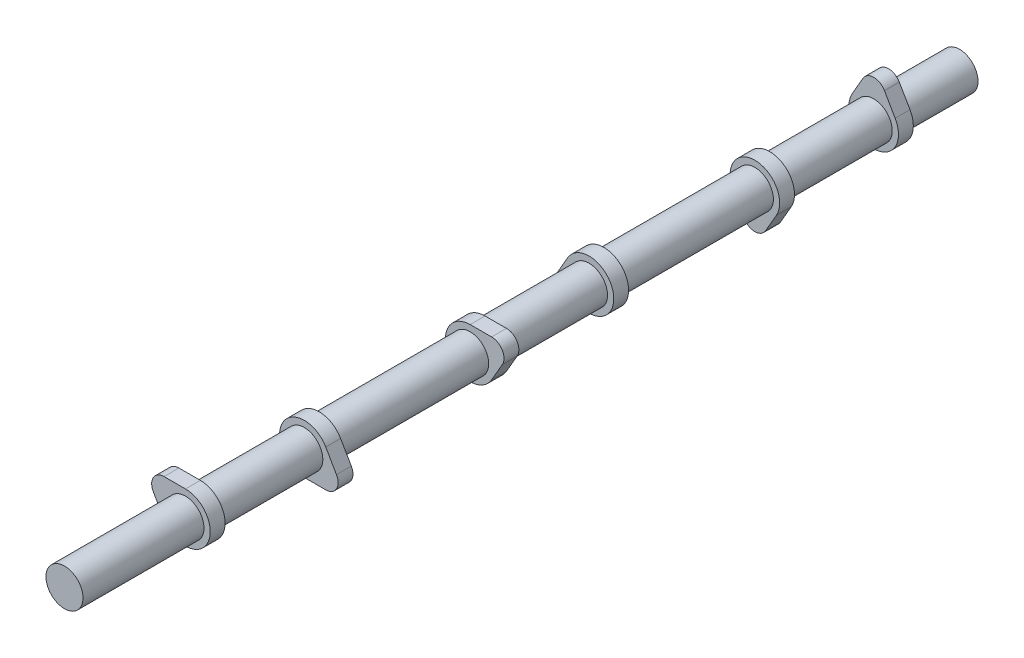
ISO-10303-21;
HEADER;
FILE_DESCRIPTION(('STEP AP214'),'2;1');
FILE_NAME('part.step','',(''),(''),'','','');
FILE_SCHEMA(('AUTOMOTIVE_DESIGN { 1 0 10303 214 1 1 1 1 }'));
ENDSEC;
DATA;
#1=APPLICATION_CONTEXT('core data for automotive mechanical design processes');
#2=APPLICATION_PROTOCOL_DEFINITION('international standard','automotive_design',2000,#1);
#3=PRODUCT_CONTEXT('',#1,'mechanical');
#4=PRODUCT('Part','Part','',(#3));
#5=PRODUCT_RELATED_PRODUCT_CATEGORY('part','',(#4));
#6=PRODUCT_DEFINITION_FORMATION('','',#4);
#7=PRODUCT_DEFINITION_CONTEXT('part definition',#1,'design');
#8=PRODUCT_DEFINITION('design','',#6,#7);
#9=PRODUCT_DEFINITION_SHAPE('','',#8);
#10=(LENGTH_UNIT() NAMED_UNIT(*) SI_UNIT(.MILLI.,.METRE.));
#11=(NAMED_UNIT(*) PLANE_ANGLE_UNIT() SI_UNIT($,.RADIAN.));
#12=(NAMED_UNIT(*) SI_UNIT($,.STERADIAN.) SOLID_ANGLE_UNIT());
#13=UNCERTAINTY_MEASURE_WITH_UNIT(LENGTH_MEASURE(1.E-05),#10,'distance_accuracy_value','');
#14=(GEOMETRIC_REPRESENTATION_CONTEXT(3) GLOBAL_UNCERTAINTY_ASSIGNED_CONTEXT((#13)) GLOBAL_UNIT_ASSIGNED_CONTEXT((#10,
#11,#12)) REPRESENTATION_CONTEXT('',''));
#15=CARTESIAN_POINT('',(0.,0.,0.));
#16=DIRECTION('',(0.,0.,1.));
#17=DIRECTION('',(1.,0.,0.));
#18=AXIS2_PLACEMENT_3D('',#15,#16,#17);
#19=CARTESIAN_POINT('',(0.,0.,116.84));
#20=DIRECTION('',(0.,0.,-1.));
#21=DIRECTION('',(-1.,0.,0.));
#22=AXIS2_PLACEMENT_3D('',#19,#20,#21);
#23=CYLINDRICAL_SURFACE('',#22,9.5);
#24=CARTESIAN_POINT('',(0.,0.,-3.80999999999999));
#25=DIRECTION('',(0.,0.,1.));
#26=DIRECTION('',(1.,0.,0.));
#27=AXIS2_PLACEMENT_3D('',#24,#25,#26);
#28=CIRCLE('',#27,9.5);
#29=CARTESIAN_POINT('',(9.5,0.,-3.80999999999999));
#30=VERTEX_POINT('',#29);
#31=EDGE_CURVE('E236',#30,#30,#28,.T.);
#32=ORIENTED_EDGE('',*,*,#31,.F.);
#33=EDGE_LOOP('',(#32));
#34=FACE_BOUND('',#33,.T.);
#35=CARTESIAN_POINT('',(0.,0.,-40.21));
#36=DIRECTION('',(0.,0.,-1.));
#37=DIRECTION('',(-1.,0.,0.));
#38=AXIS2_PLACEMENT_3D('',#35,#36,#37);
#39=CIRCLE('',#38,9.5);
#40=CARTESIAN_POINT('',(-9.5,0.,-40.21));
#41=VERTEX_POINT('',#40);
#42=EDGE_CURVE('E486',#41,#41,#39,.T.);
#43=ORIENTED_EDGE('',*,*,#42,.F.);
#44=EDGE_LOOP('',(#43));
#45=FACE_BOUND('',#44,.T.);
#46=ADVANCED_FACE('F36',(#34,#45),#23,.T.);
#47=CARTESIAN_POINT('',(0.,0.,408.94));
#48=DIRECTION('',(0.,0.,-1.));
#49=DIRECTION('',(0.499999999999992,0.866025403784443,0.));
#50=AXIS2_PLACEMENT_3D('',#47,#48,#49);
#51=CYLINDRICAL_SURFACE('',#50,9.5);
#52=CARTESIAN_POINT('',(0.,0.,295.91));
#53=DIRECTION('',(0.,0.,1.));
#54=DIRECTION('',(-0.499999999999992,-0.866025403784443,0.));
#55=AXIS2_PLACEMENT_3D('',#52,#53,#54);
#56=CIRCLE('',#55,9.5);
#57=CARTESIAN_POINT('',(-4.74999999999992,-8.22724133595221,295.91));
#58=VERTEX_POINT('',#57);
#59=EDGE_CURVE('E45',#58,#58,#56,.T.);
#60=ORIENTED_EDGE('',*,*,#59,.T.);
#61=EDGE_LOOP('',(#60));
#62=FACE_BOUND('',#61,.T.);
#63=CARTESIAN_POINT('',(0.,0.,349.25));
#64=DIRECTION('',(0.,0.,1.));
#65=DIRECTION('',(-0.499999999999992,-0.866025403784443,0.));
#66=AXIS2_PLACEMENT_3D('',#63,#64,#65);
#67=CIRCLE('',#66,9.5);
#68=CARTESIAN_POINT('',(-4.74999999999992,-8.22724133595221,349.25));
#69=VERTEX_POINT('',#68);
#70=EDGE_CURVE('E382',#69,#69,#67,.F.);
#71=ORIENTED_EDGE('',*,*,#70,.T.);
#72=EDGE_LOOP('',(#71));
#73=FACE_BOUND('',#72,.T.);
#74=ADVANCED_FACE('F411',(#62,#73),#51,.T.);
#75=CARTESIAN_POINT('',(10.9985226280624,-6.3499999999999,295.91));
#76=DIRECTION('',(0.,0.,-1.));
#77=DIRECTION('',(0.499999999999992,0.866025403784443,0.));
#78=AXIS2_PLACEMENT_3D('',#75,#76,#77);
#79=CYLINDRICAL_SURFACE('',#78,6.35);
#80=CARTESIAN_POINT('',(10.9985226280624,-6.3499999999999,288.29));
#81=DIRECTION('',(0.,0.,1.));
#82=DIRECTION('',(-0.499999999999992,-0.866025403784443,0.));
#83=AXIS2_PLACEMENT_3D('',#80,#81,#82);
#84=CIRCLE('',#83,6.35);
#85=CARTESIAN_POINT('',(10.9985226280625,-12.6999999999999,288.29));
#86=VERTEX_POINT('',#85);
#87=CARTESIAN_POINT('',(16.4977839420936,-3.17499999999985,288.29));
#88=VERTEX_POINT('',#87);
#89=EDGE_CURVE('E393',#86,#88,#84,.T.);
#90=ORIENTED_EDGE('',*,*,#89,.T.);
#91=DIRECTION('',(0.,0.,-1.));
#92=VECTOR('',#91,1.);
#93=CARTESIAN_POINT('',(16.4977839420936,-3.17499999999985,295.91));
#94=LINE('',#93,#92);
#95=CARTESIAN_POINT('',(16.4977839420936,-3.17499999999985,295.91));
#96=VERTEX_POINT('',#95);
#97=EDGE_CURVE('E385',#96,#88,#94,.T.);
#98=ORIENTED_EDGE('',*,*,#97,.F.);
#99=CARTESIAN_POINT('',(10.9985226280624,-6.3499999999999,295.91));
#100=DIRECTION('',(0.,0.,1.));
#101=DIRECTION('',(-0.499999999999992,-0.866025403784443,0.));
#102=AXIS2_PLACEMENT_3D('',#99,#100,#101);
#103=CIRCLE('',#102,6.35);
#104=CARTESIAN_POINT('',(10.9985226280625,-12.6999999999999,295.91));
#105=VERTEX_POINT('',#104);
#106=EDGE_CURVE('E386',#105,#96,#103,.T.);
#107=ORIENTED_EDGE('',*,*,#106,.F.);
#108=DIRECTION('',(0.,0.,-1.));
#109=VECTOR('',#108,1.);
#110=CARTESIAN_POINT('',(10.9985226280625,-12.6999999999999,295.91));
#111=LINE('',#110,#109);
#112=EDGE_CURVE('E392',#105,#86,#111,.T.);
#113=ORIENTED_EDGE('',*,*,#112,.T.);
#114=EDGE_LOOP('',(#90,#98,#107,#113));
#115=FACE_BOUND('',#114,.T.);
#116=ADVANCED_FACE('F38',(#115),#79,.T.);
#117=CARTESIAN_POINT('',(16.4977839420936,-3.17499999999985,295.91));
#118=DIRECTION('',(-0.866025403784434,-0.500000000000008,0.));
#119=DIRECTION('',(0.500000000000008,-0.866025403784434,0.));
#120=AXIS2_PLACEMENT_3D('',#117,#118,#119);
#121=PLANE('',#120);
#122=DIRECTION('',(-0.500000000000008,0.866025403784434,0.));
#123=VECTOR('',#122,1.);
#124=CARTESIAN_POINT('',(16.4977839420936,-3.17499999999985,288.29));
#125=LINE('',#124,#123);
#126=CARTESIAN_POINT('',(10.9985226280623,6.3500000000001,288.29));
#127=VERTEX_POINT('',#126);
#128=EDGE_CURVE('E396',#88,#127,#125,.T.);
#129=ORIENTED_EDGE('',*,*,#128,.T.);
#130=DIRECTION('',(0.,0.,-1.));
#131=VECTOR('',#130,1.);
#132=CARTESIAN_POINT('',(10.9985226280623,6.3500000000001,295.91));
#133=LINE('',#132,#131);
#134=CARTESIAN_POINT('',(10.9985226280623,6.3500000000001,295.91));
#135=VERTEX_POINT('',#134);
#136=EDGE_CURVE('E404',#135,#127,#133,.T.);
#137=ORIENTED_EDGE('',*,*,#136,.F.);
#138=DIRECTION('',(-0.500000000000008,0.866025403784434,0.));
#139=VECTOR('',#138,1.);
#140=CARTESIAN_POINT('',(16.4977839420936,-3.17499999999985,295.91));
#141=LINE('',#140,#139);
#142=EDGE_CURVE('E85',#96,#135,#141,.T.);
#143=ORIENTED_EDGE('',*,*,#142,.F.);
#144=ORIENTED_EDGE('',*,*,#97,.T.);
#145=EDGE_LOOP('',(#129,#137,#143,#144));
#146=FACE_BOUND('',#145,.T.);
#147=ADVANCED_FACE('F860',(#146),#121,.F.);
#148=CARTESIAN_POINT('',(0.,0.,295.91));
#149=DIRECTION('',(0.,0.,-1.));
#150=DIRECTION('',(0.499999999999992,0.866025403784443,0.));
#151=AXIS2_PLACEMENT_3D('',#148,#149,#150);
#152=CYLINDRICAL_SURFACE('',#151,12.7);
#153=CARTESIAN_POINT('',(0.,0.,288.29));
#154=DIRECTION('',(0.,0.,1.));
#155=DIRECTION('',(-0.499999999999992,-0.866025403784443,0.));
#156=AXIS2_PLACEMENT_3D('',#153,#154,#155);
#157=CIRCLE('',#156,12.7);
#158=CARTESIAN_POINT('',(1.196959198424E-13,-12.7,288.29));
#159=VERTEX_POINT('',#158);
#160=EDGE_CURVE('E71',#127,#159,#157,.T.);
#161=ORIENTED_EDGE('',*,*,#160,.T.);
#162=DIRECTION('',(0.,0.,-1.));
#163=VECTOR('',#162,1.);
#164=CARTESIAN_POINT('',(1.196959198424E-13,-12.7,295.91));
#165=LINE('',#164,#163);
#166=CARTESIAN_POINT('',(1.196959198424E-13,-12.7,295.91));
#167=VERTEX_POINT('',#166);
#168=EDGE_CURVE('E402',#167,#159,#165,.T.);
#169=ORIENTED_EDGE('',*,*,#168,.F.);
#170=CARTESIAN_POINT('',(0.,0.,295.91));
#171=DIRECTION('',(0.,0.,1.));
#172=DIRECTION('',(-0.499999999999992,-0.866025403784443,0.));
#173=AXIS2_PLACEMENT_3D('',#170,#171,#172);
#174=CIRCLE('',#173,12.7);
#175=EDGE_CURVE('E389',#135,#167,#174,.T.);
#176=ORIENTED_EDGE('',*,*,#175,.F.);
#177=ORIENTED_EDGE('',*,*,#136,.T.);
#178=EDGE_LOOP('',(#161,#169,#176,#177));
#179=FACE_BOUND('',#178,.T.);
#180=ADVANCED_FACE('F865',(#179),#152,.T.);
#181=CARTESIAN_POINT('',(10.9985226280625,-12.6999999999999,295.91));
#182=DIRECTION('',(0.,1.,0.));
#183=DIRECTION('',(-1.,0.,0.));
#184=AXIS2_PLACEMENT_3D('',#181,#182,#183);
#185=PLANE('',#184);
#186=DIRECTION('',(1.,0.,0.));
#187=VECTOR('',#186,1.);
#188=CARTESIAN_POINT('',(10.9985226280625,-12.6999999999999,288.29));
#189=LINE('',#188,#187);
#190=EDGE_CURVE('E77',#159,#86,#189,.T.);
#191=ORIENTED_EDGE('',*,*,#190,.T.);
#192=ORIENTED_EDGE('',*,*,#112,.F.);
#193=DIRECTION('',(1.,0.,0.));
#194=VECTOR('',#193,1.);
#195=CARTESIAN_POINT('',(10.9985226280625,-12.6999999999999,295.91));
#196=LINE('',#195,#194);
#197=EDGE_CURVE('E53',#167,#105,#196,.T.);
#198=ORIENTED_EDGE('',*,*,#197,.F.);
#199=ORIENTED_EDGE('',*,*,#168,.T.);
#200=EDGE_LOOP('',(#191,#192,#198,#199));
#201=FACE_BOUND('',#200,.T.);
#202=ADVANCED_FACE('F873',(#201),#185,.F.);
#203=CARTESIAN_POINT('',(10.9985226280624,-6.3499999999999,295.91));
#204=DIRECTION('',(0.,0.,1.));
#205=DIRECTION('',(-0.499999999999992,-0.866025403784443,0.));
#206=AXIS2_PLACEMENT_3D('',#203,#204,#205);
#207=PLANE('',#206);
#208=ORIENTED_EDGE('',*,*,#59,.F.);
#209=EDGE_LOOP('',(#208));
#210=FACE_BOUND('',#209,.T.);
#211=ORIENTED_EDGE('',*,*,#106,.T.);
#212=ORIENTED_EDGE('',*,*,#142,.T.);
#213=ORIENTED_EDGE('',*,*,#175,.T.);
#214=ORIENTED_EDGE('',*,*,#197,.T.);
#215=EDGE_LOOP('',(#211,#212,#213,#214));
#216=FACE_BOUND('',#215,.T.);
#217=ADVANCED_FACE('F531',(#210,#216),#207,.T.);
#218=CARTESIAN_POINT('',(10.9985226280624,-6.3499999999999,288.29));
#219=DIRECTION('',(0.,0.,1.));
#220=DIRECTION('',(-0.499999999999992,-0.866025403784443,0.));
#221=AXIS2_PLACEMENT_3D('',#218,#219,#220);
#222=PLANE('',#221);
#223=CARTESIAN_POINT('',(0.,0.,288.29));
#224=DIRECTION('',(0.,0.,1.));
#225=DIRECTION('',(-0.499999999999992,-0.866025403784443,0.));
#226=AXIS2_PLACEMENT_3D('',#223,#224,#225);
#227=CIRCLE('',#226,9.5);
#228=CARTESIAN_POINT('',(-4.74999999999992,-8.22724133595221,288.29));
#229=VERTEX_POINT('',#228);
#230=EDGE_CURVE('E397',#229,#229,#227,.T.);
#231=ORIENTED_EDGE('',*,*,#230,.T.);
#232=EDGE_LOOP('',(#231));
#233=FACE_BOUND('',#232,.T.);
#234=ORIENTED_EDGE('',*,*,#89,.F.);
#235=ORIENTED_EDGE('',*,*,#190,.F.);
#236=ORIENTED_EDGE('',*,*,#160,.F.);
#237=ORIENTED_EDGE('',*,*,#128,.F.);
#238=EDGE_LOOP('',(#234,#235,#236,#237));
#239=FACE_BOUND('',#238,.T.);
#240=ADVANCED_FACE('F525',(#233,#239),#222,.F.);
#241=ORIENTED_EDGE('',*,*,#230,.F.);
#242=EDGE_LOOP('',(#241));
#243=FACE_BOUND('',#242,.T.);
#244=CARTESIAN_POINT('',(0.,0.,210.82));
#245=DIRECTION('',(0.,0.,1.));
#246=DIRECTION('',(-0.500000000000004,0.866025403784436,0.));
#247=AXIS2_PLACEMENT_3D('',#244,#245,#246);
#248=CIRCLE('',#247,9.5);
#249=CARTESIAN_POINT('',(-4.75000000000004,8.22724133595215,210.82));
#250=VERTEX_POINT('',#249);
#251=EDGE_CURVE('E314',#250,#250,#248,.F.);
#252=ORIENTED_EDGE('',*,*,#251,.F.);
#253=EDGE_LOOP('',(#252));
#254=FACE_BOUND('',#253,.T.);
#255=ADVANCED_FACE('F455',(#243,#254),#51,.T.);
#256=CARTESIAN_POINT('',(-10.9985226280624,6.34999999999997,356.87));
#257=DIRECTION('',(0.,0.,-1.));
#258=DIRECTION('',(-0.499999999999998,-0.86602540378444,0.));
#259=AXIS2_PLACEMENT_3D('',#256,#257,#258);
#260=CYLINDRICAL_SURFACE('',#259,6.35);
#261=CARTESIAN_POINT('',(-10.9985226280624,6.34999999999997,349.25));
#262=DIRECTION('',(0.,0.,1.));
#263=DIRECTION('',(0.499999999999998,0.86602540378444,0.));
#264=AXIS2_PLACEMENT_3D('',#261,#262,#263);
#265=CIRCLE('',#264,6.35);
#266=CARTESIAN_POINT('',(-10.9985226280624,12.7,349.25));
#267=VERTEX_POINT('',#266);
#268=CARTESIAN_POINT('',(-16.4977839420936,3.17499999999996,349.25));
#269=VERTEX_POINT('',#268);
#270=EDGE_CURVE('E352',#267,#269,#265,.T.);
#271=ORIENTED_EDGE('',*,*,#270,.T.);
#272=DIRECTION('',(0.,0.,-1.));
#273=VECTOR('',#272,1.);
#274=CARTESIAN_POINT('',(-16.4977839420936,3.17499999999996,356.87));
#275=LINE('',#274,#273);
#276=CARTESIAN_POINT('',(-16.4977839420936,3.17499999999996,356.87));
#277=VERTEX_POINT('',#276);
#278=EDGE_CURVE('E379',#277,#269,#275,.T.);
#279=ORIENTED_EDGE('',*,*,#278,.F.);
#280=CARTESIAN_POINT('',(-10.9985226280624,6.34999999999997,356.87));
#281=DIRECTION('',(0.,0.,1.));
#282=DIRECTION('',(0.499999999999998,0.86602540378444,0.));
#283=AXIS2_PLACEMENT_3D('',#280,#281,#282);
#284=CIRCLE('',#283,6.35);
#285=CARTESIAN_POINT('',(-10.9985226280624,12.7,356.87));
#286=VERTEX_POINT('',#285);
#287=EDGE_CURVE('E353',#286,#277,#284,.T.);
#288=ORIENTED_EDGE('',*,*,#287,.F.);
#289=DIRECTION('',(0.,0.,-1.));
#290=VECTOR('',#289,1.);
#291=CARTESIAN_POINT('',(-10.9985226280624,12.7,356.87));
#292=LINE('',#291,#290);
#293=EDGE_CURVE('E363',#286,#267,#292,.T.);
#294=ORIENTED_EDGE('',*,*,#293,.T.);
#295=EDGE_LOOP('',(#271,#279,#288,#294));
#296=FACE_BOUND('',#295,.T.);
#297=ADVANCED_FACE('F424',(#296),#260,.T.);
#298=CARTESIAN_POINT('',(-16.4977839420936,3.17499999999996,356.87));
#299=DIRECTION('',(0.866025403784437,0.500000000000002,0.));
#300=DIRECTION('',(-0.500000000000002,0.866025403784437,0.));
#301=AXIS2_PLACEMENT_3D('',#298,#299,#300);
#302=PLANE('',#301);
#303=DIRECTION('',(0.500000000000002,-0.866025403784437,0.));
#304=VECTOR('',#303,1.);
#305=CARTESIAN_POINT('',(-16.4977839420936,3.17499999999996,349.25));
#306=LINE('',#305,#304);
#307=CARTESIAN_POINT('',(-10.9985226280624,-6.35000000000002,349.25));
#308=VERTEX_POINT('',#307);
#309=EDGE_CURVE('E366',#269,#308,#306,.T.);
#310=ORIENTED_EDGE('',*,*,#309,.T.);
#311=DIRECTION('',(0.,0.,-1.));
#312=VECTOR('',#311,1.);
#313=CARTESIAN_POINT('',(-10.9985226280624,-6.35000000000002,356.87));
#314=LINE('',#313,#312);
#315=CARTESIAN_POINT('',(-10.9985226280624,-6.35000000000002,356.87));
#316=VERTEX_POINT('',#315);
#317=EDGE_CURVE('E376',#316,#308,#314,.T.);
#318=ORIENTED_EDGE('',*,*,#317,.F.);
#319=DIRECTION('',(0.500000000000002,-0.866025403784437,0.));
#320=VECTOR('',#319,1.);
#321=CARTESIAN_POINT('',(-16.4977839420936,3.17499999999996,356.87));
#322=LINE('',#321,#320);
#323=EDGE_CURVE('E356',#277,#316,#322,.T.);
#324=ORIENTED_EDGE('',*,*,#323,.F.);
#325=ORIENTED_EDGE('',*,*,#278,.T.);
#326=EDGE_LOOP('',(#310,#318,#324,#325));
#327=FACE_BOUND('',#326,.T.);
#328=ADVANCED_FACE('F436',(#327),#302,.F.);
#329=CARTESIAN_POINT('',(0.,0.,356.87));
#330=DIRECTION('',(0.,0.,-1.));
#331=DIRECTION('',(-0.499999999999998,-0.86602540378444,0.));
#332=AXIS2_PLACEMENT_3D('',#329,#330,#331);
#333=CYLINDRICAL_SURFACE('',#332,12.7);
#334=CARTESIAN_POINT('',(0.,0.,349.25));
#335=DIRECTION('',(0.,0.,1.));
#336=DIRECTION('',(0.499999999999998,0.86602540378444,0.));
#337=AXIS2_PLACEMENT_3D('',#334,#335,#336);
#338=CIRCLE('',#337,12.7);
#339=CARTESIAN_POINT('',(0.,12.7,349.25));
#340=VERTEX_POINT('',#339);
#341=EDGE_CURVE('E368',#308,#340,#338,.T.);
#342=ORIENTED_EDGE('',*,*,#341,.T.);
#343=DIRECTION('',(0.,0.,-1.));
#344=VECTOR('',#343,1.);
#345=CARTESIAN_POINT('',(0.,12.7,356.87));
#346=LINE('',#345,#344);
#347=CARTESIAN_POINT('',(0.,12.7,356.87));
#348=VERTEX_POINT('',#347);
#349=EDGE_CURVE('E373',#348,#340,#346,.T.);
#350=ORIENTED_EDGE('',*,*,#349,.F.);
#351=CARTESIAN_POINT('',(0.,0.,356.87));
#352=DIRECTION('',(0.,0.,1.));
#353=DIRECTION('',(0.499999999999998,0.86602540378444,0.));
#354=AXIS2_PLACEMENT_3D('',#351,#352,#353);
#355=CIRCLE('',#354,12.7);
#356=EDGE_CURVE('E359',#316,#348,#355,.T.);
#357=ORIENTED_EDGE('',*,*,#356,.F.);
#358=ORIENTED_EDGE('',*,*,#317,.T.);
#359=EDGE_LOOP('',(#342,#350,#357,#358));
#360=FACE_BOUND('',#359,.T.);
#361=ADVANCED_FACE('F433',(#360),#333,.T.);
#362=CARTESIAN_POINT('',(-10.9985226280624,12.7,356.87));
#363=DIRECTION('',(0.,-1.,0.));
#364=DIRECTION('',(1.,0.,0.));
#365=AXIS2_PLACEMENT_3D('',#362,#363,#364);
#366=PLANE('',#365);
#367=DIRECTION('',(-1.,0.,0.));
#368=VECTOR('',#367,1.);
#369=CARTESIAN_POINT('',(-10.9985226280624,12.7,349.25));
#370=LINE('',#369,#368);
#371=EDGE_CURVE('E357',#340,#267,#370,.T.);
#372=ORIENTED_EDGE('',*,*,#371,.T.);
#373=ORIENTED_EDGE('',*,*,#293,.F.);
#374=DIRECTION('',(-1.,0.,0.));
#375=VECTOR('',#374,1.);
#376=CARTESIAN_POINT('',(-10.9985226280624,12.7,356.87));
#377=LINE('',#376,#375);
#378=EDGE_CURVE('E361',#348,#286,#377,.T.);
#379=ORIENTED_EDGE('',*,*,#378,.F.);
#380=ORIENTED_EDGE('',*,*,#349,.T.);
#381=EDGE_LOOP('',(#372,#373,#379,#380));
#382=FACE_BOUND('',#381,.T.);
#383=ADVANCED_FACE('F429',(#382),#366,.F.);
#384=CARTESIAN_POINT('',(-10.9985226280624,6.34999999999997,356.87));
#385=DIRECTION('',(0.,0.,1.));
#386=DIRECTION('',(0.499999999999998,0.86602540378444,0.));
#387=AXIS2_PLACEMENT_3D('',#384,#385,#386);
#388=PLANE('',#387);
#389=CARTESIAN_POINT('',(0.,0.,356.87));
#390=DIRECTION('',(0.,0.,1.));
#391=DIRECTION('',(-0.499999999999992,-0.866025403784443,0.));
#392=AXIS2_PLACEMENT_3D('',#389,#390,#391);
#393=CIRCLE('',#392,9.5);
#394=CARTESIAN_POINT('',(-4.74999999999992,-8.22724133595221,356.87));
#395=VERTEX_POINT('',#394);
#396=EDGE_CURVE('E11',#395,#395,#393,.F.);
#397=ORIENTED_EDGE('',*,*,#396,.T.);
#398=EDGE_LOOP('',(#397));
#399=FACE_BOUND('',#398,.T.);
#400=ORIENTED_EDGE('',*,*,#287,.T.);
#401=ORIENTED_EDGE('',*,*,#323,.T.);
#402=ORIENTED_EDGE('',*,*,#356,.T.);
#403=ORIENTED_EDGE('',*,*,#378,.T.);
#404=EDGE_LOOP('',(#400,#401,#402,#403));
#405=FACE_BOUND('',#404,.T.);
#406=ADVANCED_FACE('F417',(#399,#405),#388,.T.);
#407=CARTESIAN_POINT('',(-10.9985226280624,6.34999999999997,349.25));
#408=DIRECTION('',(0.,0.,1.));
#409=DIRECTION('',(0.499999999999998,0.86602540378444,0.));
#410=AXIS2_PLACEMENT_3D('',#407,#408,#409);
#411=PLANE('',#410);
#412=ORIENTED_EDGE('',*,*,#70,.F.);
#413=EDGE_LOOP('',(#412));
#414=FACE_BOUND('',#413,.T.);
#415=ORIENTED_EDGE('',*,*,#270,.F.);
#416=ORIENTED_EDGE('',*,*,#371,.F.);
#417=ORIENTED_EDGE('',*,*,#341,.F.);
#418=ORIENTED_EDGE('',*,*,#309,.F.);
#419=EDGE_LOOP('',(#415,#416,#417,#418));
#420=FACE_BOUND('',#419,.T.);
#421=ADVANCED_FACE('F413',(#414,#420),#411,.F.);
#422=ORIENTED_EDGE('',*,*,#396,.F.);
#423=EDGE_LOOP('',(#422));
#424=FACE_BOUND('',#423,.T.);
#425=CARTESIAN_POINT('',(0.,0.,418.94));
#426=DIRECTION('',(0.,0.,1.));
#427=DIRECTION('',(1.,0.,0.));
#428=AXIS2_PLACEMENT_3D('',#425,#426,#427);
#429=CIRCLE('',#428,9.5);
#430=CARTESIAN_POINT('',(9.5,0.,418.94));
#431=VERTEX_POINT('',#430);
#432=EDGE_CURVE('E491',#431,#431,#429,.T.);
#433=ORIENTED_EDGE('',*,*,#432,.F.);
#434=EDGE_LOOP('',(#433));
#435=FACE_BOUND('',#434,.T.);
#436=ADVANCED_FACE('F416',(#424,#435),#51,.T.);
#437=CARTESIAN_POINT('',(0.,0.,262.89));
#438=DIRECTION('',(0.,0.,-1.));
#439=DIRECTION('',(0.500000000000004,-0.866025403784436,0.));
#440=AXIS2_PLACEMENT_3D('',#437,#438,#439);
#441=CYLINDRICAL_SURFACE('',#440,9.5);
#442=CARTESIAN_POINT('',(0.,0.,149.86));
#443=DIRECTION('',(0.,0.,1.));
#444=DIRECTION('',(-0.500000000000004,0.866025403784436,0.));
#445=AXIS2_PLACEMENT_3D('',#442,#443,#444);
#446=CIRCLE('',#445,9.5);
#447=CARTESIAN_POINT('',(-4.75000000000004,8.22724133595215,149.86));
#448=VERTEX_POINT('',#447);
#449=EDGE_CURVE('E311',#448,#448,#446,.T.);
#450=ORIENTED_EDGE('',*,*,#449,.T.);
#451=EDGE_LOOP('',(#450));
#452=FACE_BOUND('',#451,.T.);
#453=CARTESIAN_POINT('',(0.,0.,203.2));
#454=DIRECTION('',(0.,0.,1.));
#455=DIRECTION('',(-0.500000000000004,0.866025403784436,0.));
#456=AXIS2_PLACEMENT_3D('',#453,#454,#455);
#457=CIRCLE('',#456,9.5);
#458=CARTESIAN_POINT('',(-4.75000000000004,8.22724133595215,203.2));
#459=VERTEX_POINT('',#458);
#460=EDGE_CURVE('E310',#459,#459,#457,.F.);
#461=ORIENTED_EDGE('',*,*,#460,.T.);
#462=EDGE_LOOP('',(#461));
#463=FACE_BOUND('',#462,.T.);
#464=ADVANCED_FACE('F512',(#452,#463),#441,.T.);
#465=CARTESIAN_POINT('',(-10.9985226280623,-6.35000000000005,149.86));
#466=DIRECTION('',(0.,0.,-1.));
#467=DIRECTION('',(0.500000000000004,-0.866025403784436,0.));
#468=AXIS2_PLACEMENT_3D('',#465,#466,#467);
#469=CYLINDRICAL_SURFACE('',#468,6.35);
#470=CARTESIAN_POINT('',(-10.9985226280623,-6.35000000000005,142.24));
#471=DIRECTION('',(0.,0.,1.));
#472=DIRECTION('',(-0.500000000000004,0.866025403784436,0.));
#473=AXIS2_PLACEMENT_3D('',#470,#471,#472);
#474=CIRCLE('',#473,6.35);
#475=CARTESIAN_POINT('',(-16.4977839420935,-3.17500000000008,142.24));
#476=VERTEX_POINT('',#475);
#477=CARTESIAN_POINT('',(-10.9985226280623,-12.7000000000001,142.24));
#478=VERTEX_POINT('',#477);
#479=EDGE_CURVE('E327',#476,#478,#474,.T.);
#480=ORIENTED_EDGE('',*,*,#479,.T.);
#481=DIRECTION('',(0.,0.,-1.));
#482=VECTOR('',#481,1.);
#483=CARTESIAN_POINT('',(-10.9985226280623,-12.7000000000001,149.86));
#484=LINE('',#483,#482);
#485=CARTESIAN_POINT('',(-10.9985226280623,-12.7000000000001,149.86));
#486=VERTEX_POINT('',#485);
#487=EDGE_CURVE('E315',#486,#478,#484,.T.);
#488=ORIENTED_EDGE('',*,*,#487,.F.);
#489=CARTESIAN_POINT('',(-10.9985226280623,-6.35000000000005,149.86));
#490=DIRECTION('',(0.,0.,1.));
#491=DIRECTION('',(-0.500000000000004,0.866025403784436,0.));
#492=AXIS2_PLACEMENT_3D('',#489,#490,#491);
#493=CIRCLE('',#492,6.35);
#494=CARTESIAN_POINT('',(-16.4977839420935,-3.17500000000008,149.86));
#495=VERTEX_POINT('',#494);
#496=EDGE_CURVE('E316',#495,#486,#493,.T.);
#497=ORIENTED_EDGE('',*,*,#496,.F.);
#498=DIRECTION('',(0.,0.,-1.));
#499=VECTOR('',#498,1.);
#500=CARTESIAN_POINT('',(-16.4977839420935,-3.17500000000008,149.86));
#501=LINE('',#500,#499);
#502=EDGE_CURVE('E326',#495,#476,#501,.T.);
#503=ORIENTED_EDGE('',*,*,#502,.T.);
#504=EDGE_LOOP('',(#480,#488,#497,#503));
#505=FACE_BOUND('',#504,.T.);
#506=ADVANCED_FACE('F517',(#505),#469,.T.);
#507=CARTESIAN_POINT('',(-10.9985226280623,-12.7000000000001,149.86));
#508=DIRECTION('',(0.,1.,0.));
#509=DIRECTION('',(-1.,0.,0.));
#510=AXIS2_PLACEMENT_3D('',#507,#508,#509);
#511=PLANE('',#510);
#512=DIRECTION('',(1.,0.,0.));
#513=VECTOR('',#512,1.);
#514=CARTESIAN_POINT('',(-10.9985226280623,-12.7000000000001,142.24));
#515=LINE('',#514,#513);
#516=CARTESIAN_POINT('',(0.,-12.7,142.24));
#517=VERTEX_POINT('',#516);
#518=EDGE_CURVE('E330',#478,#517,#515,.T.);
#519=ORIENTED_EDGE('',*,*,#518,.T.);
#520=DIRECTION('',(0.,0.,-1.));
#521=VECTOR('',#520,1.);
#522=CARTESIAN_POINT('',(0.,-12.7,149.86));
#523=LINE('',#522,#521);
#524=CARTESIAN_POINT('',(0.,-12.7,149.86));
#525=VERTEX_POINT('',#524);
#526=EDGE_CURVE('E341',#525,#517,#523,.T.);
#527=ORIENTED_EDGE('',*,*,#526,.F.);
#528=DIRECTION('',(1.,0.,0.));
#529=VECTOR('',#528,1.);
#530=CARTESIAN_POINT('',(-10.9985226280623,-12.7000000000001,149.86));
#531=LINE('',#530,#529);
#532=EDGE_CURVE('E319',#486,#525,#531,.T.);
#533=ORIENTED_EDGE('',*,*,#532,.F.);
#534=ORIENTED_EDGE('',*,*,#487,.T.);
#535=EDGE_LOOP('',(#519,#527,#533,#534));
#536=FACE_BOUND('',#535,.T.);
#537=ADVANCED_FACE('F586',(#536),#511,.F.);
#538=CARTESIAN_POINT('',(0.,0.,149.86));
#539=DIRECTION('',(0.,0.,-1.));
#540=DIRECTION('',(0.500000000000004,-0.866025403784436,0.));
#541=AXIS2_PLACEMENT_3D('',#538,#539,#540);
#542=CYLINDRICAL_SURFACE('',#541,12.7);
#543=CARTESIAN_POINT('',(0.,0.,142.24));
#544=DIRECTION('',(0.,0.,1.));
#545=DIRECTION('',(-0.500000000000004,0.866025403784436,0.));
#546=AXIS2_PLACEMENT_3D('',#543,#544,#545);
#547=CIRCLE('',#546,12.7);
#548=CARTESIAN_POINT('',(-10.9985226280624,6.34999999999995,142.24));
#549=VERTEX_POINT('',#548);
#550=EDGE_CURVE('E333',#517,#549,#547,.T.);
#551=ORIENTED_EDGE('',*,*,#550,.T.);
#552=DIRECTION('',(0.,0.,-1.));
#553=VECTOR('',#552,1.);
#554=CARTESIAN_POINT('',(-10.9985226280624,6.34999999999995,149.86));
#555=LINE('',#554,#553);
#556=CARTESIAN_POINT('',(-10.9985226280624,6.34999999999995,149.86));
#557=VERTEX_POINT('',#556);
#558=EDGE_CURVE('E338',#557,#549,#555,.T.);
#559=ORIENTED_EDGE('',*,*,#558,.F.);
#560=CARTESIAN_POINT('',(0.,0.,149.86));
#561=DIRECTION('',(0.,0.,1.));
#562=DIRECTION('',(-0.500000000000004,0.866025403784436,0.));
#563=AXIS2_PLACEMENT_3D('',#560,#561,#562);
#564=CIRCLE('',#563,12.7);
#565=EDGE_CURVE('E322',#525,#557,#564,.T.);
#566=ORIENTED_EDGE('',*,*,#565,.F.);
#567=ORIENTED_EDGE('',*,*,#526,.T.);
#568=EDGE_LOOP('',(#551,#559,#566,#567));
#569=FACE_BOUND('',#568,.T.);
#570=ADVANCED_FACE('F582',(#569),#542,.T.);
#571=CARTESIAN_POINT('',(-16.4977839420935,-3.17500000000008,149.86));
#572=DIRECTION('',(0.866025403784441,-0.499999999999996,0.));
#573=DIRECTION('',(0.499999999999996,0.866025403784441,0.));
#574=AXIS2_PLACEMENT_3D('',#571,#572,#573);
#575=PLANE('',#574);
#576=DIRECTION('',(-0.499999999999996,-0.866025403784441,0.));
#577=VECTOR('',#576,1.);
#578=CARTESIAN_POINT('',(-16.4977839420935,-3.17500000000008,142.24));
#579=LINE('',#578,#577);
#580=EDGE_CURVE('E320',#549,#476,#579,.T.);
#581=ORIENTED_EDGE('',*,*,#580,.T.);
#582=ORIENTED_EDGE('',*,*,#502,.F.);
#583=DIRECTION('',(-0.499999999999996,-0.866025403784441,0.));
#584=VECTOR('',#583,1.);
#585=CARTESIAN_POINT('',(-16.4977839420935,-3.17500000000008,149.86));
#586=LINE('',#585,#584);
#587=EDGE_CURVE('E324',#557,#495,#586,.T.);
#588=ORIENTED_EDGE('',*,*,#587,.F.);
#589=ORIENTED_EDGE('',*,*,#558,.T.);
#590=EDGE_LOOP('',(#581,#582,#588,#589));
#591=FACE_BOUND('',#590,.T.);
#592=ADVANCED_FACE('F575',(#591),#575,.F.);
#593=CARTESIAN_POINT('',(-10.9985226280623,-6.35000000000005,149.86));
#594=DIRECTION('',(0.,0.,1.));
#595=DIRECTION('',(-0.500000000000004,0.866025403784436,0.));
#596=AXIS2_PLACEMENT_3D('',#593,#594,#595);
#597=PLANE('',#596);
#598=ORIENTED_EDGE('',*,*,#449,.F.);
#599=EDGE_LOOP('',(#598));
#600=FACE_BOUND('',#599,.T.);
#601=ORIENTED_EDGE('',*,*,#496,.T.);
#602=ORIENTED_EDGE('',*,*,#532,.T.);
#603=ORIENTED_EDGE('',*,*,#565,.T.);
#604=ORIENTED_EDGE('',*,*,#587,.T.);
#605=EDGE_LOOP('',(#601,#602,#603,#604));
#606=FACE_BOUND('',#605,.T.);
#607=ADVANCED_FACE('F571',(#600,#606),#597,.T.);
#608=CARTESIAN_POINT('',(-10.9985226280623,-6.35000000000005,142.24));
#609=DIRECTION('',(0.,0.,1.));
#610=DIRECTION('',(-0.500000000000004,0.866025403784436,0.));
#611=AXIS2_PLACEMENT_3D('',#608,#609,#610);
#612=PLANE('',#611);
#613=CARTESIAN_POINT('',(0.,0.,142.24));
#614=DIRECTION('',(0.,0.,1.));
#615=DIRECTION('',(-0.500000000000004,0.866025403784436,0.));
#616=AXIS2_PLACEMENT_3D('',#613,#614,#615);
#617=CIRCLE('',#616,9.5);
#618=CARTESIAN_POINT('',(-4.75000000000004,8.22724133595215,142.24));
#619=VERTEX_POINT('',#618);
#620=EDGE_CURVE('E331',#619,#619,#617,.T.);
#621=ORIENTED_EDGE('',*,*,#620,.T.);
#622=EDGE_LOOP('',(#621));
#623=FACE_BOUND('',#622,.T.);
#624=ORIENTED_EDGE('',*,*,#479,.F.);
#625=ORIENTED_EDGE('',*,*,#580,.F.);
#626=ORIENTED_EDGE('',*,*,#550,.F.);
#627=ORIENTED_EDGE('',*,*,#518,.F.);
#628=EDGE_LOOP('',(#624,#625,#626,#627));
#629=FACE_BOUND('',#628,.T.);
#630=ADVANCED_FACE('F574',(#623,#629),#612,.F.);
#631=ORIENTED_EDGE('',*,*,#620,.F.);
#632=EDGE_LOOP('',(#631));
#633=FACE_BOUND('',#632,.T.);
#634=CARTESIAN_POINT('',(0.,0.,64.77));
#635=DIRECTION('',(0.,0.,1.));
#636=DIRECTION('',(1.,0.,0.));
#637=AXIS2_PLACEMENT_3D('',#634,#635,#636);
#638=CIRCLE('',#637,9.5);
#639=CARTESIAN_POINT('',(9.5,0.,64.77));
#640=VERTEX_POINT('',#639);
#641=EDGE_CURVE('E245',#640,#640,#638,.F.);
#642=ORIENTED_EDGE('',*,*,#641,.F.);
#643=EDGE_LOOP('',(#642));
#644=FACE_BOUND('',#643,.T.);
#645=ADVANCED_FACE('F520',(#633,#644),#441,.T.);
#646=CARTESIAN_POINT('',(10.9985226280624,6.34999999999997,210.82));
#647=DIRECTION('',(0.,0.,-1.));
#648=DIRECTION('',(-0.499999999999998,0.86602540378444,0.));
#649=AXIS2_PLACEMENT_3D('',#646,#647,#648);
#650=CYLINDRICAL_SURFACE('',#649,6.35);
#651=CARTESIAN_POINT('',(10.9985226280624,6.34999999999997,203.2));
#652=DIRECTION('',(0.,0.,1.));
#653=DIRECTION('',(0.499999999999998,-0.86602540378444,0.));
#654=AXIS2_PLACEMENT_3D('',#651,#652,#653);
#655=CIRCLE('',#654,6.35);
#656=CARTESIAN_POINT('',(16.4977839420936,3.17499999999996,203.2));
#657=VERTEX_POINT('',#656);
#658=CARTESIAN_POINT('',(10.9985226280624,12.7,203.2));
#659=VERTEX_POINT('',#658);
#660=EDGE_CURVE('E280',#657,#659,#655,.T.);
#661=ORIENTED_EDGE('',*,*,#660,.T.);
#662=DIRECTION('',(0.,0.,-1.));
#663=VECTOR('',#662,1.);
#664=CARTESIAN_POINT('',(10.9985226280624,12.7,210.82));
#665=LINE('',#664,#663);
#666=CARTESIAN_POINT('',(10.9985226280624,12.7,210.82));
#667=VERTEX_POINT('',#666);
#668=EDGE_CURVE('E307',#667,#659,#665,.T.);
#669=ORIENTED_EDGE('',*,*,#668,.F.);
#670=CARTESIAN_POINT('',(10.9985226280624,6.34999999999997,210.82));
#671=DIRECTION('',(0.,0.,1.));
#672=DIRECTION('',(0.499999999999998,-0.86602540378444,0.));
#673=AXIS2_PLACEMENT_3D('',#670,#671,#672);
#674=CIRCLE('',#673,6.35);
#675=CARTESIAN_POINT('',(16.4977839420936,3.17499999999996,210.82));
#676=VERTEX_POINT('',#675);
#677=EDGE_CURVE('E281',#676,#667,#674,.T.);
#678=ORIENTED_EDGE('',*,*,#677,.F.);
#679=DIRECTION('',(0.,0.,-1.));
#680=VECTOR('',#679,1.);
#681=CARTESIAN_POINT('',(16.4977839420936,3.17499999999996,210.82));
#682=LINE('',#681,#680);
#683=EDGE_CURVE('E291',#676,#657,#682,.T.);
#684=ORIENTED_EDGE('',*,*,#683,.T.);
#685=EDGE_LOOP('',(#661,#669,#678,#684));
#686=FACE_BOUND('',#685,.T.);
#687=ADVANCED_FACE('F548',(#686),#650,.T.);
#688=CARTESIAN_POINT('',(10.9985226280624,12.7,210.82));
#689=DIRECTION('',(0.,-1.,0.));
#690=DIRECTION('',(1.,0.,0.));
#691=AXIS2_PLACEMENT_3D('',#688,#689,#690);
#692=PLANE('',#691);
#693=DIRECTION('',(-1.,0.,0.));
#694=VECTOR('',#693,1.);
#695=CARTESIAN_POINT('',(10.9985226280624,12.7,203.2));
#696=LINE('',#695,#694);
#697=CARTESIAN_POINT('',(0.,12.7,203.2));
#698=VERTEX_POINT('',#697);
#699=EDGE_CURVE('E294',#659,#698,#696,.T.);
#700=ORIENTED_EDGE('',*,*,#699,.T.);
#701=DIRECTION('',(0.,0.,-1.));
#702=VECTOR('',#701,1.);
#703=CARTESIAN_POINT('',(0.,12.7,210.82));
#704=LINE('',#703,#702);
#705=CARTESIAN_POINT('',(0.,12.7,210.82));
#706=VERTEX_POINT('',#705);
#707=EDGE_CURVE('E304',#706,#698,#704,.T.);
#708=ORIENTED_EDGE('',*,*,#707,.F.);
#709=DIRECTION('',(-1.,0.,0.));
#710=VECTOR('',#709,1.);
#711=CARTESIAN_POINT('',(10.9985226280624,12.7,210.82));
#712=LINE('',#711,#710);
#713=EDGE_CURVE('E284',#667,#706,#712,.T.);
#714=ORIENTED_EDGE('',*,*,#713,.F.);
#715=ORIENTED_EDGE('',*,*,#668,.T.);
#716=EDGE_LOOP('',(#700,#708,#714,#715));
#717=FACE_BOUND('',#716,.T.);
#718=ADVANCED_FACE('F551',(#717),#692,.F.);
#719=CARTESIAN_POINT('',(0.,0.,210.82));
#720=DIRECTION('',(0.,0.,-1.));
#721=DIRECTION('',(-0.499999999999998,0.86602540378444,0.));
#722=AXIS2_PLACEMENT_3D('',#719,#720,#721);
#723=CYLINDRICAL_SURFACE('',#722,12.7);
#724=CARTESIAN_POINT('',(0.,0.,203.2));
#725=DIRECTION('',(0.,0.,1.));
#726=DIRECTION('',(0.499999999999998,-0.86602540378444,0.));
#727=AXIS2_PLACEMENT_3D('',#724,#725,#726);
#728=CIRCLE('',#727,12.7);
#729=CARTESIAN_POINT('',(10.9985226280624,-6.35000000000003,203.2));
#730=VERTEX_POINT('',#729);
#731=EDGE_CURVE('E296',#698,#730,#728,.T.);
#732=ORIENTED_EDGE('',*,*,#731,.T.);
#733=DIRECTION('',(0.,0.,-1.));
#734=VECTOR('',#733,1.);
#735=CARTESIAN_POINT('',(10.9985226280624,-6.35000000000003,210.82));
#736=LINE('',#735,#734);
#737=CARTESIAN_POINT('',(10.9985226280624,-6.35000000000003,210.82));
#738=VERTEX_POINT('',#737);
#739=EDGE_CURVE('E301',#738,#730,#736,.T.);
#740=ORIENTED_EDGE('',*,*,#739,.F.);
#741=CARTESIAN_POINT('',(0.,0.,210.82));
#742=DIRECTION('',(0.,0.,1.));
#743=DIRECTION('',(0.499999999999998,-0.86602540378444,0.));
#744=AXIS2_PLACEMENT_3D('',#741,#742,#743);
#745=CIRCLE('',#744,12.7);
#746=EDGE_CURVE('E287',#706,#738,#745,.T.);
#747=ORIENTED_EDGE('',*,*,#746,.F.);
#748=ORIENTED_EDGE('',*,*,#707,.T.);
#749=EDGE_LOOP('',(#732,#740,#747,#748));
#750=FACE_BOUND('',#749,.T.);
#751=ADVANCED_FACE('F556',(#750),#723,.T.);
#752=CARTESIAN_POINT('',(16.4977839420936,3.17499999999996,210.82));
#753=DIRECTION('',(-0.866025403784438,0.500000000000002,0.));
#754=DIRECTION('',(-0.500000000000002,-0.866025403784438,0.));
#755=AXIS2_PLACEMENT_3D('',#752,#753,#754);
#756=PLANE('',#755);
#757=DIRECTION('',(0.500000000000002,0.866025403784438,0.));
#758=VECTOR('',#757,1.);
#759=CARTESIAN_POINT('',(16.4977839420936,3.17499999999996,203.2));
#760=LINE('',#759,#758);
#761=EDGE_CURVE('E285',#730,#657,#760,.T.);
#762=ORIENTED_EDGE('',*,*,#761,.T.);
#763=ORIENTED_EDGE('',*,*,#683,.F.);
#764=DIRECTION('',(0.500000000000002,0.866025403784438,0.));
#765=VECTOR('',#764,1.);
#766=CARTESIAN_POINT('',(16.4977839420936,3.17499999999996,210.82));
#767=LINE('',#766,#765);
#768=EDGE_CURVE('E289',#738,#676,#767,.T.);
#769=ORIENTED_EDGE('',*,*,#768,.F.);
#770=ORIENTED_EDGE('',*,*,#739,.T.);
#771=EDGE_LOOP('',(#762,#763,#769,#770));
#772=FACE_BOUND('',#771,.T.);
#773=ADVANCED_FACE('F540',(#772),#756,.F.);
#774=CARTESIAN_POINT('',(10.9985226280624,6.34999999999997,210.82));
#775=DIRECTION('',(0.,0.,1.));
#776=DIRECTION('',(0.499999999999998,-0.86602540378444,0.));
#777=AXIS2_PLACEMENT_3D('',#774,#775,#776);
#778=PLANE('',#777);
#779=ORIENTED_EDGE('',*,*,#251,.T.);
#780=EDGE_LOOP('',(#779));
#781=FACE_BOUND('',#780,.T.);
#782=ORIENTED_EDGE('',*,*,#677,.T.);
#783=ORIENTED_EDGE('',*,*,#713,.T.);
#784=ORIENTED_EDGE('',*,*,#746,.T.);
#785=ORIENTED_EDGE('',*,*,#768,.T.);
#786=EDGE_LOOP('',(#782,#783,#784,#785));
#787=FACE_BOUND('',#786,.T.);
#788=ADVANCED_FACE('F471',(#781,#787),#778,.T.);
#789=CARTESIAN_POINT('',(10.9985226280624,6.34999999999997,203.2));
#790=DIRECTION('',(0.,0.,1.));
#791=DIRECTION('',(0.499999999999998,-0.86602540378444,0.));
#792=AXIS2_PLACEMENT_3D('',#789,#790,#791);
#793=PLANE('',#792);
#794=ORIENTED_EDGE('',*,*,#460,.F.);
#795=EDGE_LOOP('',(#794));
#796=FACE_BOUND('',#795,.T.);
#797=ORIENTED_EDGE('',*,*,#660,.F.);
#798=ORIENTED_EDGE('',*,*,#761,.F.);
#799=ORIENTED_EDGE('',*,*,#731,.F.);
#800=ORIENTED_EDGE('',*,*,#699,.F.);
#801=EDGE_LOOP('',(#797,#798,#799,#800));
#802=FACE_BOUND('',#801,.T.);
#803=ADVANCED_FACE('F462',(#796,#802),#793,.F.);
#804=CARTESIAN_POINT('',(0.,0.,3.80999999999999));
#805=DIRECTION('',(0.,0.,1.));
#806=DIRECTION('',(1.,0.,0.));
#807=AXIS2_PLACEMENT_3D('',#804,#805,#806);
#808=CIRCLE('',#807,9.5);
#809=CARTESIAN_POINT('',(9.5,0.,3.80999999999999));
#810=VERTEX_POINT('',#809);
#811=EDGE_CURVE('E242',#810,#810,#808,.T.);
#812=ORIENTED_EDGE('',*,*,#811,.T.);
#813=EDGE_LOOP('',(#812));
#814=FACE_BOUND('',#813,.T.);
#815=CARTESIAN_POINT('',(0.,0.,57.15));
#816=DIRECTION('',(0.,0.,1.));
#817=DIRECTION('',(1.,0.,0.));
#818=AXIS2_PLACEMENT_3D('',#815,#816,#817);
#819=CIRCLE('',#818,9.5);
#820=CARTESIAN_POINT('',(9.5,0.,57.15));
#821=VERTEX_POINT('',#820);
#822=EDGE_CURVE('E233',#821,#821,#819,.F.);
#823=ORIENTED_EDGE('',*,*,#822,.T.);
#824=EDGE_LOOP('',(#823));
#825=FACE_BOUND('',#824,.T.);
#826=ADVANCED_FACE('F449',(#814,#825),#23,.T.);
#827=CARTESIAN_POINT('',(0.,12.7,3.81));
#828=DIRECTION('',(0.,0.,-1.));
#829=DIRECTION('',(-1.,0.,0.));
#830=AXIS2_PLACEMENT_3D('',#827,#828,#829);
#831=CYLINDRICAL_SURFACE('',#830,6.35);
#832=CARTESIAN_POINT('',(0.,12.7,-3.81));
#833=DIRECTION('',(0.,0.,1.));
#834=DIRECTION('',(1.,0.,0.));
#835=AXIS2_PLACEMENT_3D('',#832,#833,#834);
#836=CIRCLE('',#835,6.35);
#837=CARTESIAN_POINT('',(5.49926131403118,15.875,-3.81));
#838=VERTEX_POINT('',#837);
#839=CARTESIAN_POINT('',(-5.49926131403118,15.875,-3.81));
#840=VERTEX_POINT('',#839);
#841=EDGE_CURVE('E258',#838,#840,#836,.T.);
#842=ORIENTED_EDGE('',*,*,#841,.T.);
#843=DIRECTION('',(0.,0.,-1.));
#844=VECTOR('',#843,1.);
#845=CARTESIAN_POINT('',(-5.49926131403118,15.875,3.81));
#846=LINE('',#845,#844);
#847=CARTESIAN_POINT('',(-5.49926131403118,15.875,3.81));
#848=VERTEX_POINT('',#847);
#849=EDGE_CURVE('E246',#848,#840,#846,.T.);
#850=ORIENTED_EDGE('',*,*,#849,.F.);
#851=CARTESIAN_POINT('',(0.,12.7,3.81));
#852=DIRECTION('',(0.,0.,1.));
#853=DIRECTION('',(1.,0.,0.));
#854=AXIS2_PLACEMENT_3D('',#851,#852,#853);
#855=CIRCLE('',#854,6.35);
#856=CARTESIAN_POINT('',(5.49926131403118,15.875,3.81));
#857=VERTEX_POINT('',#856);
#858=EDGE_CURVE('E247',#857,#848,#855,.T.);
#859=ORIENTED_EDGE('',*,*,#858,.F.);
#860=DIRECTION('',(0.,0.,-1.));
#861=VECTOR('',#860,1.);
#862=CARTESIAN_POINT('',(5.49926131403118,15.875,3.81));
#863=LINE('',#862,#861);
#864=EDGE_CURVE('E257',#857,#838,#863,.T.);
#865=ORIENTED_EDGE('',*,*,#864,.T.);
#866=EDGE_LOOP('',(#842,#850,#859,#865));
#867=FACE_BOUND('',#866,.T.);
#868=ADVANCED_FACE('F461',(#867),#831,.T.);
#869=CARTESIAN_POINT('',(-5.49926131403118,15.875,3.81));
#870=DIRECTION('',(0.866025403784439,-0.5,0.));
#871=DIRECTION('',(0.5,0.866025403784439,0.));
#872=AXIS2_PLACEMENT_3D('',#869,#870,#871);
#873=PLANE('',#872);
#874=DIRECTION('',(-0.5,-0.866025403784439,0.));
#875=VECTOR('',#874,1.);
#876=CARTESIAN_POINT('',(-5.49926131403118,15.875,-3.81));
#877=LINE('',#876,#875);
#878=CARTESIAN_POINT('',(-10.9985226280624,6.35,-3.81));
#879=VERTEX_POINT('',#878);
#880=EDGE_CURVE('E261',#840,#879,#877,.T.);
#881=ORIENTED_EDGE('',*,*,#880,.T.);
#882=DIRECTION('',(0.,0.,-1.));
#883=VECTOR('',#882,1.);
#884=CARTESIAN_POINT('',(-10.9985226280624,6.35,3.81));
#885=LINE('',#884,#883);
#886=CARTESIAN_POINT('',(-10.9985226280624,6.35,3.81));
#887=VERTEX_POINT('',#886);
#888=EDGE_CURVE('E271',#887,#879,#885,.T.);
#889=ORIENTED_EDGE('',*,*,#888,.F.);
#890=DIRECTION('',(-0.5,-0.866025403784439,0.));
#891=VECTOR('',#890,1.);
#892=CARTESIAN_POINT('',(-5.49926131403118,15.875,3.81));
#893=LINE('',#892,#891);
#894=EDGE_CURVE('E250',#848,#887,#893,.T.);
#895=ORIENTED_EDGE('',*,*,#894,.F.);
#896=ORIENTED_EDGE('',*,*,#849,.T.);
#897=EDGE_LOOP('',(#881,#889,#895,#896));
#898=FACE_BOUND('',#897,.T.);
#899=ADVANCED_FACE('F468',(#898),#873,.F.);
#900=CARTESIAN_POINT('',(0.,0.,3.81));
#901=DIRECTION('',(0.,0.,-1.));
#902=DIRECTION('',(-1.,0.,0.));
#903=AXIS2_PLACEMENT_3D('',#900,#901,#902);
#904=CYLINDRICAL_SURFACE('',#903,12.7);
#905=CARTESIAN_POINT('',(0.,0.,-3.81));
#906=DIRECTION('',(0.,0.,1.));
#907=DIRECTION('',(1.,0.,0.));
#908=AXIS2_PLACEMENT_3D('',#905,#906,#907);
#909=CIRCLE('',#908,12.7);
#910=CARTESIAN_POINT('',(10.9985226280624,6.35,-3.81));
#911=VERTEX_POINT('',#910);
#912=EDGE_CURVE('E263',#879,#911,#909,.T.);
#913=ORIENTED_EDGE('',*,*,#912,.T.);
#914=DIRECTION('',(0.,0.,-1.));
#915=VECTOR('',#914,1.);
#916=CARTESIAN_POINT('',(10.9985226280624,6.35,3.81));
#917=LINE('',#916,#915);
#918=CARTESIAN_POINT('',(10.9985226280624,6.35,3.81));
#919=VERTEX_POINT('',#918);
#920=EDGE_CURVE('E268',#919,#911,#917,.T.);
#921=ORIENTED_EDGE('',*,*,#920,.F.);
#922=CARTESIAN_POINT('',(0.,0.,3.81));
#923=DIRECTION('',(0.,0.,1.));
#924=DIRECTION('',(1.,0.,0.));
#925=AXIS2_PLACEMENT_3D('',#922,#923,#924);
#926=CIRCLE('',#925,12.7);
#927=EDGE_CURVE('E253',#887,#919,#926,.T.);
#928=ORIENTED_EDGE('',*,*,#927,.F.);
#929=ORIENTED_EDGE('',*,*,#888,.T.);
#930=EDGE_LOOP('',(#913,#921,#928,#929));
#931=FACE_BOUND('',#930,.T.);
#932=ADVANCED_FACE('F677',(#931),#904,.T.);
#933=CARTESIAN_POINT('',(5.49926131403118,15.875,3.81));
#934=DIRECTION('',(-0.866025403784439,-0.5,0.));
#935=DIRECTION('',(0.5,-0.866025403784439,0.));
#936=AXIS2_PLACEMENT_3D('',#933,#934,#935);
#937=PLANE('',#936);
#938=DIRECTION('',(-0.5,0.866025403784439,0.));
#939=VECTOR('',#938,1.);
#940=CARTESIAN_POINT('',(5.49926131403118,15.875,-3.81));
#941=LINE('',#940,#939);
#942=EDGE_CURVE('E251',#911,#838,#941,.T.);
#943=ORIENTED_EDGE('',*,*,#942,.T.);
#944=ORIENTED_EDGE('',*,*,#864,.F.);
#945=DIRECTION('',(-0.5,0.866025403784439,0.));
#946=VECTOR('',#945,1.);
#947=CARTESIAN_POINT('',(5.49926131403118,15.875,3.81));
#948=LINE('',#947,#946);
#949=EDGE_CURVE('E255',#919,#857,#948,.T.);
#950=ORIENTED_EDGE('',*,*,#949,.F.);
#951=ORIENTED_EDGE('',*,*,#920,.T.);
#952=EDGE_LOOP('',(#943,#944,#950,#951));
#953=FACE_BOUND('',#952,.T.);
#954=ADVANCED_FACE('F686',(#953),#937,.F.);
#955=CARTESIAN_POINT('',(0.,12.7,3.81));
#956=DIRECTION('',(0.,0.,1.));
#957=DIRECTION('',(1.,0.,0.));
#958=AXIS2_PLACEMENT_3D('',#955,#956,#957);
#959=PLANE('',#958);
#960=ORIENTED_EDGE('',*,*,#811,.F.);
#961=EDGE_LOOP('',(#960));
#962=FACE_BOUND('',#961,.T.);
#963=ORIENTED_EDGE('',*,*,#858,.T.);
#964=ORIENTED_EDGE('',*,*,#894,.T.);
#965=ORIENTED_EDGE('',*,*,#927,.T.);
#966=ORIENTED_EDGE('',*,*,#949,.T.);
#967=EDGE_LOOP('',(#963,#964,#965,#966));
#968=FACE_BOUND('',#967,.T.);
#969=ADVANCED_FACE('F695',(#962,#968),#959,.T.);
#970=CARTESIAN_POINT('',(0.,12.7,-3.81));
#971=DIRECTION('',(0.,0.,1.));
#972=DIRECTION('',(1.,0.,0.));
#973=AXIS2_PLACEMENT_3D('',#970,#971,#972);
#974=PLANE('',#973);
#975=ORIENTED_EDGE('',*,*,#31,.T.);
#976=EDGE_LOOP('',(#975));
#977=FACE_BOUND('',#976,.T.);
#978=ORIENTED_EDGE('',*,*,#841,.F.);
#979=ORIENTED_EDGE('',*,*,#942,.F.);
#980=ORIENTED_EDGE('',*,*,#912,.F.);
#981=ORIENTED_EDGE('',*,*,#880,.F.);
#982=EDGE_LOOP('',(#978,#979,#980,#981));
#983=FACE_BOUND('',#982,.T.);
#984=ADVANCED_FACE('F704',(#977,#983),#974,.F.);
#985=CARTESIAN_POINT('',(0.,-12.7,64.77));
#986=DIRECTION('',(0.,0.,-1.));
#987=DIRECTION('',(1.,0.,0.));
#988=AXIS2_PLACEMENT_3D('',#985,#986,#987);
#989=CYLINDRICAL_SURFACE('',#988,6.35);
#990=CARTESIAN_POINT('',(0.,-12.7,57.15));
#991=DIRECTION('',(0.,0.,1.));
#992=DIRECTION('',(-1.,0.,0.));
#993=AXIS2_PLACEMENT_3D('',#990,#991,#992);
#994=CIRCLE('',#993,6.35);
#995=CARTESIAN_POINT('',(-5.4992613140313,-15.875,57.15));
#996=VERTEX_POINT('',#995);
#997=CARTESIAN_POINT('',(5.49926131403107,-15.875,57.15));
#998=VERTEX_POINT('',#997);
#999=EDGE_CURVE('E232',#996,#998,#994,.T.);
#1000=ORIENTED_EDGE('',*,*,#999,.T.);
#1001=DIRECTION('',(0.,0.,-1.));
#1002=VECTOR('',#1001,1.);
#1003=CARTESIAN_POINT('',(5.49926131403107,-15.875,64.77));
#1004=LINE('',#1003,#1002);
#1005=CARTESIAN_POINT('',(5.49926131403107,-15.875,64.77));
#1006=VERTEX_POINT('',#1005);
#1007=EDGE_CURVE('E212',#1006,#998,#1004,.T.);
#1008=ORIENTED_EDGE('',*,*,#1007,.F.);
#1009=CARTESIAN_POINT('',(0.,-12.7,64.77));
#1010=DIRECTION('',(0.,0.,1.));
#1011=DIRECTION('',(-1.,0.,0.));
#1012=AXIS2_PLACEMENT_3D('',#1009,#1010,#1011);
#1013=CIRCLE('',#1012,6.35);
#1014=CARTESIAN_POINT('',(-5.4992613140313,-15.875,64.77));
#1015=VERTEX_POINT('',#1014);
#1016=EDGE_CURVE('E219',#1015,#1006,#1013,.T.);
#1017=ORIENTED_EDGE('',*,*,#1016,.F.);
#1018=DIRECTION('',(0.,0.,-1.));
#1019=VECTOR('',#1018,1.);
#1020=CARTESIAN_POINT('',(-5.4992613140313,-15.875,64.77));
#1021=LINE('',#1020,#1019);
#1022=EDGE_CURVE('E498',#1015,#996,#1021,.T.);
#1023=ORIENTED_EDGE('',*,*,#1022,.T.);
#1024=EDGE_LOOP('',(#1000,#1008,#1017,#1023));
#1025=FACE_BOUND('',#1024,.T.);
#1026=ADVANCED_FACE('F230',(#1025),#989,.T.);
#1027=CARTESIAN_POINT('',(5.49926131403107,-15.875,64.77));
#1028=DIRECTION('',(-0.866025403784435,0.500000000000006,0.));
#1029=DIRECTION('',(-0.500000000000006,-0.866025403784435,0.));
#1030=AXIS2_PLACEMENT_3D('',#1027,#1028,#1029);
#1031=PLANE('',#1030);
#1032=DIRECTION('',(0.500000000000006,0.866025403784435,0.));
#1033=VECTOR('',#1032,1.);
#1034=CARTESIAN_POINT('',(5.49926131403107,-15.875,57.15));
#1035=LINE('',#1034,#1033);
#1036=CARTESIAN_POINT('',(10.9985226280623,-6.35000000000008,57.15));
#1037=VERTEX_POINT('',#1036);
#1038=EDGE_CURVE('E485',#998,#1037,#1035,.T.);
#1039=ORIENTED_EDGE('',*,*,#1038,.T.);
#1040=DIRECTION('',(0.,0.,-1.));
#1041=VECTOR('',#1040,1.);
#1042=CARTESIAN_POINT('',(10.9985226280623,-6.35000000000008,64.77));
#1043=LINE('',#1042,#1041);
#1044=CARTESIAN_POINT('',(10.9985226280623,-6.35000000000008,64.77));
#1045=VERTEX_POINT('',#1044);
#1046=EDGE_CURVE('E215',#1045,#1037,#1043,.T.);
#1047=ORIENTED_EDGE('',*,*,#1046,.F.);
#1048=DIRECTION('',(0.500000000000006,0.866025403784435,0.));
#1049=VECTOR('',#1048,1.);
#1050=CARTESIAN_POINT('',(5.49926131403107,-15.875,64.77));
#1051=LINE('',#1050,#1049);
#1052=EDGE_CURVE('E208',#1006,#1045,#1051,.T.);
#1053=ORIENTED_EDGE('',*,*,#1052,.F.);
#1054=ORIENTED_EDGE('',*,*,#1007,.T.);
#1055=EDGE_LOOP('',(#1039,#1047,#1053,#1054));
#1056=FACE_BOUND('',#1055,.T.);
#1057=ADVANCED_FACE('F210',(#1056),#1031,.F.);
#1058=CARTESIAN_POINT('',(0.,0.,64.77));
#1059=DIRECTION('',(0.,0.,-1.));
#1060=DIRECTION('',(1.,0.,0.));
#1061=AXIS2_PLACEMENT_3D('',#1058,#1059,#1060);
#1062=CYLINDRICAL_SURFACE('',#1061,12.7);
#1063=CARTESIAN_POINT('',(0.,0.,57.15));
#1064=DIRECTION('',(0.,0.,1.));
#1065=DIRECTION('',(-1.,0.,0.));
#1066=AXIS2_PLACEMENT_3D('',#1063,#1064,#1065);
#1067=CIRCLE('',#1066,12.7);
#1068=CARTESIAN_POINT('',(-10.9985226280624,-6.34999999999992,57.15));
#1069=VERTEX_POINT('',#1068);
#1070=EDGE_CURVE('E488',#1037,#1069,#1067,.T.);
#1071=ORIENTED_EDGE('',*,*,#1070,.T.);
#1072=DIRECTION('',(0.,0.,-1.));
#1073=VECTOR('',#1072,1.);
#1074=CARTESIAN_POINT('',(-10.9985226280624,-6.34999999999992,64.77));
#1075=LINE('',#1074,#1073);
#1076=CARTESIAN_POINT('',(-10.9985226280624,-6.34999999999992,64.77));
#1077=VERTEX_POINT('',#1076);
#1078=EDGE_CURVE('E238',#1077,#1069,#1075,.T.);
#1079=ORIENTED_EDGE('',*,*,#1078,.F.);
#1080=CARTESIAN_POINT('',(0.,0.,64.77));
#1081=DIRECTION('',(0.,0.,1.));
#1082=DIRECTION('',(-1.,0.,0.));
#1083=AXIS2_PLACEMENT_3D('',#1080,#1081,#1082);
#1084=CIRCLE('',#1083,12.7);
#1085=EDGE_CURVE('E218',#1045,#1077,#1084,.T.);
#1086=ORIENTED_EDGE('',*,*,#1085,.F.);
#1087=ORIENTED_EDGE('',*,*,#1046,.T.);
#1088=EDGE_LOOP('',(#1071,#1079,#1086,#1087));
#1089=FACE_BOUND('',#1088,.T.);
#1090=ADVANCED_FACE('F504',(#1089),#1062,.T.);
#1091=CARTESIAN_POINT('',(-5.4992613140313,-15.875,64.77));
#1092=DIRECTION('',(0.866025403784442,0.499999999999994,0.));
#1093=DIRECTION('',(-0.499999999999994,0.866025403784442,0.));
#1094=AXIS2_PLACEMENT_3D('',#1091,#1092,#1093);
#1095=PLANE('',#1094);
#1096=DIRECTION('',(0.499999999999994,-0.866025403784442,0.));
#1097=VECTOR('',#1096,1.);
#1098=CARTESIAN_POINT('',(-5.4992613140313,-15.875,57.15));
#1099=LINE('',#1098,#1097);
#1100=EDGE_CURVE('E228',#1069,#996,#1099,.T.);
#1101=ORIENTED_EDGE('',*,*,#1100,.T.);
#1102=ORIENTED_EDGE('',*,*,#1022,.F.);
#1103=DIRECTION('',(0.499999999999994,-0.866025403784442,0.));
#1104=VECTOR('',#1103,1.);
#1105=CARTESIAN_POINT('',(-5.4992613140313,-15.875,64.77));
#1106=LINE('',#1105,#1104);
#1107=EDGE_CURVE('E224',#1077,#1015,#1106,.T.);
#1108=ORIENTED_EDGE('',*,*,#1107,.F.);
#1109=ORIENTED_EDGE('',*,*,#1078,.T.);
#1110=EDGE_LOOP('',(#1101,#1102,#1108,#1109));
#1111=FACE_BOUND('',#1110,.T.);
#1112=ADVANCED_FACE('F502',(#1111),#1095,.F.);
#1113=CARTESIAN_POINT('',(0.,-12.7,64.77));
#1114=DIRECTION('',(0.,0.,1.));
#1115=DIRECTION('',(-1.,0.,0.));
#1116=AXIS2_PLACEMENT_3D('',#1113,#1114,#1115);
#1117=PLANE('',#1116);
#1118=ORIENTED_EDGE('',*,*,#641,.T.);
#1119=EDGE_LOOP('',(#1118));
#1120=FACE_BOUND('',#1119,.T.);
#1121=ORIENTED_EDGE('',*,*,#1016,.T.);
#1122=ORIENTED_EDGE('',*,*,#1052,.T.);
#1123=ORIENTED_EDGE('',*,*,#1085,.T.);
#1124=ORIENTED_EDGE('',*,*,#1107,.T.);
#1125=EDGE_LOOP('',(#1121,#1122,#1123,#1124));
#1126=FACE_BOUND('',#1125,.T.);
#1127=ADVANCED_FACE('F222',(#1120,#1126),#1117,.T.);
#1128=CARTESIAN_POINT('',(0.,-12.7,57.15));
#1129=DIRECTION('',(0.,0.,1.));
#1130=DIRECTION('',(-1.,0.,0.));
#1131=AXIS2_PLACEMENT_3D('',#1128,#1129,#1130);
#1132=PLANE('',#1131);
#1133=ORIENTED_EDGE('',*,*,#822,.F.);
#1134=EDGE_LOOP('',(#1133));
#1135=FACE_BOUND('',#1134,.T.);
#1136=ORIENTED_EDGE('',*,*,#999,.F.);
#1137=ORIENTED_EDGE('',*,*,#1100,.F.);
#1138=ORIENTED_EDGE('',*,*,#1070,.F.);
#1139=ORIENTED_EDGE('',*,*,#1038,.F.);
#1140=EDGE_LOOP('',(#1136,#1137,#1138,#1139));
#1141=FACE_BOUND('',#1140,.T.);
#1142=ADVANCED_FACE('F478',(#1135,#1141),#1132,.F.);
#1143=CARTESIAN_POINT('',(0.,0.,-40.21));
#1144=DIRECTION('',(0.,0.,-1.));
#1145=DIRECTION('',(-1.,0.,0.));
#1146=AXIS2_PLACEMENT_3D('',#1143,#1144,#1145);
#1147=PLANE('',#1146);
#1148=ORIENTED_EDGE('',*,*,#42,.T.);
#1149=EDGE_LOOP('',(#1148));
#1150=FACE_BOUND('',#1149,.T.);
#1151=ADVANCED_FACE('F481',(#1150),#1147,.T.);
#1152=CARTESIAN_POINT('',(0.,0.,418.94));
#1153=DIRECTION('',(0.,0.,1.));
#1154=DIRECTION('',(1.,0.,0.));
#1155=AXIS2_PLACEMENT_3D('',#1152,#1153,#1154);
#1156=PLANE('',#1155);
#1157=ORIENTED_EDGE('',*,*,#432,.T.);
#1158=EDGE_LOOP('',(#1157));
#1159=FACE_BOUND('',#1158,.T.);
#1160=ADVANCED_FACE('F509',(#1159),#1156,.T.);
#1161=CLOSED_SHELL('',(#46,#74,#116,#147,#180,#202,#217,#240,#255,#297,#328,#361,#383,#406,#421,
#436,#464,#506,#537,#570,#592,#607,#630,#645,#687,#718,#751,#773,#788,#803,#826,#868,#899,#932,
#954,#969,#984,#1026,#1057,#1090,#1112,#1127,#1142,#1151,#1160));
#1162=MANIFOLD_SOLID_BREP('B2',#1161);
#1163=ADVANCED_BREP_SHAPE_REPRESENTATION('',(#18,#1162),#14);
#1164=SHAPE_DEFINITION_REPRESENTATION(#9,#1163);
ENDSEC;
END-ISO-10303-21;
